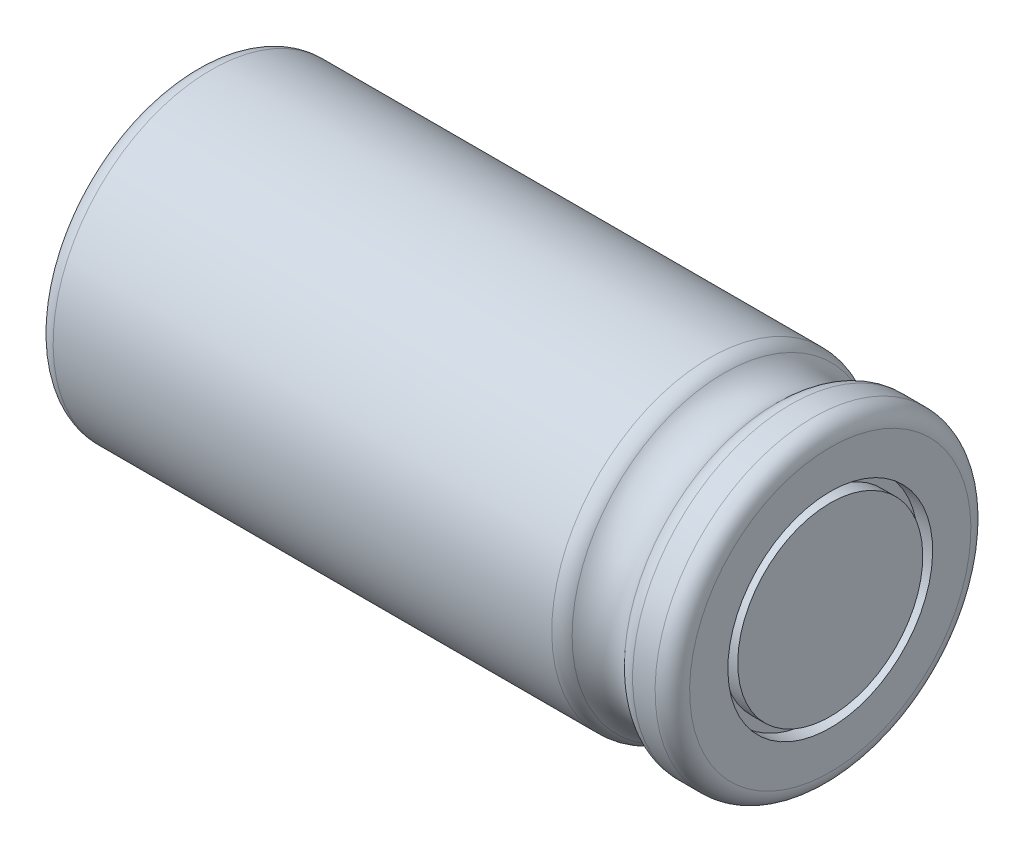
ISO-10303-21;
HEADER;
FILE_DESCRIPTION(('STEP AP214'),'2;1');
FILE_NAME('part.step','',(''),(''),'','','');
FILE_SCHEMA(('AUTOMOTIVE_DESIGN { 1 0 10303 214 1 1 1 1 }'));
ENDSEC;
DATA;
#1=APPLICATION_CONTEXT('core data for automotive mechanical design processes');
#2=APPLICATION_PROTOCOL_DEFINITION('international standard','automotive_design',2000,#1);
#3=PRODUCT_CONTEXT('',#1,'mechanical');
#4=PRODUCT('Part','Part','',(#3));
#5=PRODUCT_RELATED_PRODUCT_CATEGORY('part','',(#4));
#6=PRODUCT_DEFINITION_FORMATION('','',#4);
#7=PRODUCT_DEFINITION_CONTEXT('part definition',#1,'design');
#8=PRODUCT_DEFINITION('design','',#6,#7);
#9=PRODUCT_DEFINITION_SHAPE('','',#8);
#10=(LENGTH_UNIT() NAMED_UNIT(*) SI_UNIT(.MILLI.,.METRE.));
#11=(NAMED_UNIT(*) PLANE_ANGLE_UNIT() SI_UNIT($,.RADIAN.));
#12=(NAMED_UNIT(*) SI_UNIT($,.STERADIAN.) SOLID_ANGLE_UNIT());
#13=UNCERTAINTY_MEASURE_WITH_UNIT(LENGTH_MEASURE(1.E-05),#10,'distance_accuracy_value','');
#14=(GEOMETRIC_REPRESENTATION_CONTEXT(3) GLOBAL_UNCERTAINTY_ASSIGNED_CONTEXT((#13)) GLOBAL_UNIT_ASSIGNED_CONTEXT((#10,
#11,#12)) REPRESENTATION_CONTEXT('',''));
#15=CARTESIAN_POINT('',(0.,0.,0.));
#16=DIRECTION('',(0.,0.,1.));
#17=DIRECTION('',(1.,0.,0.));
#18=AXIS2_PLACEMENT_3D('',#15,#16,#17);
#19=CARTESIAN_POINT('',(0.,0.,0.));
#20=DIRECTION('',(-1.,0.,0.));
#21=DIRECTION('',(0.,-1.,0.));
#22=AXIS2_PLACEMENT_3D('',#19,#20,#21);
#23=PLANE('',#22);
#24=CARTESIAN_POINT('',(0.,0.,0.));
#25=DIRECTION('',(1.,0.,0.));
#26=DIRECTION('',(0.,1.,0.));
#27=AXIS2_PLACEMENT_3D('',#24,#25,#26);
#28=CIRCLE('',#27,4.85);
#29=CARTESIAN_POINT('',(0.,4.85,0.));
#30=VERTEX_POINT('',#29);
#31=EDGE_CURVE('E205',#30,#30,#28,.T.);
#32=ORIENTED_EDGE('',*,*,#31,.F.);
#33=EDGE_LOOP('',(#32));
#34=FACE_BOUND('',#33,.T.);
#35=DIRECTION('',(0.,-0.499999999999998,0.86602540378444));
#36=VECTOR('',#35,1.);
#37=CARTESIAN_POINT('',(0.,-0.043301270189222,-0.0249999999999999));
#38=LINE('',#37,#36);
#39=CARTESIAN_POINT('',(0.,-0.0577350269189625,0.));
#40=VERTEX_POINT('',#39);
#41=CARTESIAN_POINT('',(0.,-2.29330127018921,3.87211431702998));
#42=VERTEX_POINT('',#41);
#43=EDGE_CURVE('E176',#40,#42,#38,.T.);
#44=ORIENTED_EDGE('',*,*,#43,.F.);
#45=DIRECTION('',(0.,-0.499999999999998,-0.86602540378444));
#46=VECTOR('',#45,1.);
#47=CARTESIAN_POINT('',(0.,-0.043301270189222,0.0249999999999999));
#48=LINE('',#47,#46);
#49=CARTESIAN_POINT('',(0.,-2.29330127018921,-3.87211431702998));
#50=VERTEX_POINT('',#49);
#51=EDGE_CURVE('E122',#40,#50,#48,.T.);
#52=ORIENTED_EDGE('',*,*,#51,.T.);
#53=DIRECTION('',(0.,0.866025403784439,-0.5));
#54=VECTOR('',#53,1.);
#55=CARTESIAN_POINT('',(0.,-2.29330127018921,-3.87211431702998));
#56=LINE('',#55,#54);
#57=CARTESIAN_POINT('',(0.,-2.20669872981077,-3.92211431702998));
#58=VERTEX_POINT('',#57);
#59=EDGE_CURVE('E394',#50,#58,#56,.T.);
#60=ORIENTED_EDGE('',*,*,#59,.T.);
#61=DIRECTION('',(0.,-0.499999999999998,-0.86602540378444));
#62=VECTOR('',#61,1.);
#63=CARTESIAN_POINT('',(0.,0.043301270189222,-0.0249999999999999));
#64=LINE('',#63,#62);
#65=CARTESIAN_POINT('',(0.,0.0288675134594815,-0.0500000000000001));
#66=VERTEX_POINT('',#65);
#67=EDGE_CURVE('E191',#66,#58,#64,.T.);
#68=ORIENTED_EDGE('',*,*,#67,.F.);
#69=DIRECTION('',(0.,-1.,0.));
#70=VECTOR('',#69,1.);
#71=CARTESIAN_POINT('',(0.,4.5,-0.05));
#72=LINE('',#71,#70);
#73=CARTESIAN_POINT('',(0.,4.5,-0.05));
#74=VERTEX_POINT('',#73);
#75=EDGE_CURVE('E170',#74,#66,#72,.T.);
#76=ORIENTED_EDGE('',*,*,#75,.F.);
#77=DIRECTION('',(0.,0.,1.));
#78=VECTOR('',#77,1.);
#79=CARTESIAN_POINT('',(0.,4.5,-0.05));
#80=LINE('',#79,#78);
#81=CARTESIAN_POINT('',(0.,4.5,0.05));
#82=VERTEX_POINT('',#81);
#83=EDGE_CURVE('E180',#74,#82,#80,.T.);
#84=ORIENTED_EDGE('',*,*,#83,.T.);
#85=DIRECTION('',(0.,-1.,0.));
#86=VECTOR('',#85,1.);
#87=CARTESIAN_POINT('',(0.,4.5,0.05));
#88=LINE('',#87,#86);
#89=CARTESIAN_POINT('',(0.,0.0288675134594814,0.05));
#90=VERTEX_POINT('',#89);
#91=EDGE_CURVE('E186',#82,#90,#88,.T.);
#92=ORIENTED_EDGE('',*,*,#91,.T.);
#93=DIRECTION('',(0.,-0.499999999999998,0.86602540378444));
#94=VECTOR('',#93,1.);
#95=CARTESIAN_POINT('',(0.,0.043301270189222,0.0249999999999999));
#96=LINE('',#95,#94);
#97=CARTESIAN_POINT('',(0.,-2.20669872981077,3.92211431702998));
#98=VERTEX_POINT('',#97);
#99=EDGE_CURVE('E374',#90,#98,#96,.T.);
#100=ORIENTED_EDGE('',*,*,#99,.T.);
#101=DIRECTION('',(0.,-0.866025403784441,-0.499999999999997));
#102=VECTOR('',#101,1.);
#103=CARTESIAN_POINT('',(0.,-2.20669872981077,3.92211431702998));
#104=LINE('',#103,#102);
#105=EDGE_CURVE('E378',#98,#42,#104,.T.);
#106=ORIENTED_EDGE('',*,*,#105,.T.);
#107=EDGE_LOOP('',(#44,#52,#60,#68,#76,#84,#92,#100,#106));
#108=FACE_BOUND('',#107,.T.);
#109=ADVANCED_FACE('F107',(#34,#108),#23,.T.);
#110=CARTESIAN_POINT('',(25.7,3.75,0.));
#111=DIRECTION('',(1.,0.,0.));
#112=DIRECTION('',(0.,1.,0.));
#113=AXIS2_PLACEMENT_3D('',#110,#111,#112);
#114=PLANE('',#113);
#115=CARTESIAN_POINT('',(25.7,0.,0.));
#116=DIRECTION('',(1.,0.,0.));
#117=DIRECTION('',(0.,1.,0.));
#118=AXIS2_PLACEMENT_3D('',#115,#116,#117);
#119=CIRCLE('',#118,3.75);
#120=CARTESIAN_POINT('',(25.7,3.75,0.));
#121=VERTEX_POINT('',#120);
#122=EDGE_CURVE('E222',#121,#121,#119,.T.);
#123=ORIENTED_EDGE('',*,*,#122,.T.);
#124=EDGE_LOOP('',(#123));
#125=FACE_BOUND('',#124,.T.);
#126=ADVANCED_FACE('F288',(#125),#114,.T.);
#127=CARTESIAN_POINT('',(25.7,0.,0.));
#128=DIRECTION('',(1.,0.,0.));
#129=DIRECTION('',(0.,1.,0.));
#130=AXIS2_PLACEMENT_3D('',#127,#128,#129);
#131=CYLINDRICAL_SURFACE('',#130,3.75);
#132=CARTESIAN_POINT('',(25.1,0.,0.));
#133=DIRECTION('',(1.,0.,0.));
#134=DIRECTION('',(0.,1.,0.));
#135=AXIS2_PLACEMENT_3D('',#132,#133,#134);
#136=CIRCLE('',#135,3.75);
#137=CARTESIAN_POINT('',(25.1,3.75,0.));
#138=VERTEX_POINT('',#137);
#139=EDGE_CURVE('E219',#138,#138,#136,.T.);
#140=ORIENTED_EDGE('',*,*,#139,.T.);
#141=EDGE_LOOP('',(#140));
#142=FACE_BOUND('',#141,.T.);
#143=ORIENTED_EDGE('',*,*,#122,.F.);
#144=EDGE_LOOP('',(#143));
#145=FACE_BOUND('',#144,.T.);
#146=ADVANCED_FACE('F282',(#142,#145),#131,.T.);
#147=CARTESIAN_POINT('',(25.1,4.15,0.));
#148=DIRECTION('',(1.,0.,0.));
#149=DIRECTION('',(0.,1.,0.));
#150=AXIS2_PLACEMENT_3D('',#147,#148,#149);
#151=PLANE('',#150);
#152=CARTESIAN_POINT('',(25.1,0.,0.));
#153=DIRECTION('',(1.,0.,0.));
#154=DIRECTION('',(0.,1.,0.));
#155=AXIS2_PLACEMENT_3D('',#152,#153,#154);
#156=CIRCLE('',#155,4.15);
#157=CARTESIAN_POINT('',(25.1,4.15,0.));
#158=VERTEX_POINT('',#157);
#159=EDGE_CURVE('E216',#158,#158,#156,.T.);
#160=ORIENTED_EDGE('',*,*,#159,.T.);
#161=EDGE_LOOP('',(#160));
#162=FACE_BOUND('',#161,.T.);
#163=ORIENTED_EDGE('',*,*,#139,.F.);
#164=EDGE_LOOP('',(#163));
#165=FACE_BOUND('',#164,.T.);
#166=ADVANCED_FACE('F276',(#162,#165),#151,.T.);
#167=CARTESIAN_POINT('',(25.7,0.,0.));
#168=DIRECTION('',(1.,0.,0.));
#169=DIRECTION('',(0.,1.,0.));
#170=AXIS2_PLACEMENT_3D('',#167,#168,#169);
#171=CYLINDRICAL_SURFACE('',#170,4.15);
#172=CARTESIAN_POINT('',(25.7,0.,0.));
#173=DIRECTION('',(1.,0.,0.));
#174=DIRECTION('',(0.,1.,0.));
#175=AXIS2_PLACEMENT_3D('',#172,#173,#174);
#176=CIRCLE('',#175,4.15);
#177=CARTESIAN_POINT('',(25.7,4.15,0.));
#178=VERTEX_POINT('',#177);
#179=EDGE_CURVE('E213',#178,#178,#176,.T.);
#180=ORIENTED_EDGE('',*,*,#179,.T.);
#181=EDGE_LOOP('',(#180));
#182=FACE_BOUND('',#181,.T.);
#183=ORIENTED_EDGE('',*,*,#159,.F.);
#184=EDGE_LOOP('',(#183));
#185=FACE_BOUND('',#184,.T.);
#186=ADVANCED_FACE('F270',(#182,#185),#171,.F.);
#187=CARTESIAN_POINT('',(25.7,6.4,0.));
#188=DIRECTION('',(1.,0.,0.));
#189=DIRECTION('',(0.,1.,0.));
#190=AXIS2_PLACEMENT_3D('',#187,#188,#189);
#191=PLANE('',#190);
#192=CARTESIAN_POINT('',(25.7,0.,0.));
#193=DIRECTION('',(1.,0.,0.));
#194=DIRECTION('',(0.,1.,0.));
#195=AXIS2_PLACEMENT_3D('',#192,#193,#194);
#196=CIRCLE('',#195,5.7);
#197=CARTESIAN_POINT('',(25.7,5.7,0.));
#198=VERTEX_POINT('',#197);
#199=EDGE_CURVE('E225',#198,#198,#196,.T.);
#200=ORIENTED_EDGE('',*,*,#199,.T.);
#201=EDGE_LOOP('',(#200));
#202=FACE_BOUND('',#201,.T.);
#203=ORIENTED_EDGE('',*,*,#179,.F.);
#204=EDGE_LOOP('',(#203));
#205=FACE_BOUND('',#204,.T.);
#206=ADVANCED_FACE('F257',(#202,#205),#191,.T.);
#207=CARTESIAN_POINT('',(25.7,0.,0.));
#208=DIRECTION('',(1.,0.,0.));
#209=DIRECTION('',(0.,1.,0.));
#210=AXIS2_PLACEMENT_3D('',#207,#208,#209);
#211=CYLINDRICAL_SURFACE('',#210,6.4);
#212=CARTESIAN_POINT('',(24.0878339354163,0.,0.));
#213=DIRECTION('',(-1.,0.,0.));
#214=DIRECTION('',(0.,-1.,0.));
#215=AXIS2_PLACEMENT_3D('',#212,#213,#214);
#216=CIRCLE('',#215,6.4);
#217=CARTESIAN_POINT('',(24.0878339354163,-6.4,0.));
#218=VERTEX_POINT('',#217);
#219=EDGE_CURVE('E237',#218,#218,#216,.F.);
#220=ORIENTED_EDGE('',*,*,#219,.T.);
#221=EDGE_LOOP('',(#220));
#222=FACE_BOUND('',#221,.T.);
#223=CARTESIAN_POINT('',(25.,0.,0.));
#224=DIRECTION('',(1.,0.,0.));
#225=DIRECTION('',(0.,1.,0.));
#226=AXIS2_PLACEMENT_3D('',#223,#224,#225);
#227=CIRCLE('',#226,6.4);
#228=CARTESIAN_POINT('',(25.,6.4,0.));
#229=VERTEX_POINT('',#228);
#230=EDGE_CURVE('E228',#229,#229,#227,.F.);
#231=ORIENTED_EDGE('',*,*,#230,.T.);
#232=EDGE_LOOP('',(#231));
#233=FACE_BOUND('',#232,.T.);
#234=ADVANCED_FACE('F254',(#222,#233),#211,.T.);
#235=CARTESIAN_POINT('',(22.45,0.,0.));
#236=DIRECTION('',(1.,0.,0.));
#237=DIRECTION('',(0.,1.,0.));
#238=AXIS2_PLACEMENT_3D('',#235,#236,#237);
#239=TOROIDAL_SURFACE('',#238,7.16607142857143,1.46607142857143);
#240=CARTESIAN_POINT('',(23.5096230582952,0.,0.));
#241=DIRECTION('',(-1.,0.,0.));
#242=DIRECTION('',(0.,-1.,0.));
#243=AXIS2_PLACEMENT_3D('',#240,#241,#242);
#244=CIRCLE('',#243,6.15287628053601);
#245=CARTESIAN_POINT('',(23.5096230582952,-6.15287628053601,0.));
#246=VERTEX_POINT('',#245);
#247=EDGE_CURVE('E115',#246,#246,#244,.T.);
#248=ORIENTED_EDGE('',*,*,#247,.T.);
#249=EDGE_LOOP('',(#248));
#250=FACE_BOUND('',#249,.T.);
#251=CARTESIAN_POINT('',(21.3903769417048,0.,0.));
#252=DIRECTION('',(1.,0.,0.));
#253=DIRECTION('',(0.,1.,0.));
#254=AXIS2_PLACEMENT_3D('',#251,#252,#253);
#255=CIRCLE('',#254,6.15287628053601);
#256=CARTESIAN_POINT('',(21.3903769417048,6.15287628053601,0.));
#257=VERTEX_POINT('',#256);
#258=EDGE_CURVE('E240',#257,#257,#255,.T.);
#259=ORIENTED_EDGE('',*,*,#258,.T.);
#260=EDGE_LOOP('',(#259));
#261=FACE_BOUND('',#260,.T.);
#262=ADVANCED_FACE('F245',(#250,#261),#239,.F.);
#263=CARTESIAN_POINT('',(25.7,0.,0.));
#264=DIRECTION('',(1.,0.,0.));
#265=DIRECTION('',(0.,1.,0.));
#266=AXIS2_PLACEMENT_3D('',#263,#264,#265);
#267=CYLINDRICAL_SURFACE('',#266,6.4);
#268=CARTESIAN_POINT('',(20.8121660645837,0.,0.));
#269=DIRECTION('',(-1.,0.,0.));
#270=DIRECTION('',(0.,-1.,0.));
#271=AXIS2_PLACEMENT_3D('',#268,#269,#270);
#272=CIRCLE('',#271,6.4);
#273=CARTESIAN_POINT('',(20.8121660645837,-6.4,0.));
#274=VERTEX_POINT('',#273);
#275=EDGE_CURVE('E12',#274,#274,#272,.T.);
#276=ORIENTED_EDGE('',*,*,#275,.T.);
#277=EDGE_LOOP('',(#276));
#278=FACE_BOUND('',#277,.T.);
#279=CARTESIAN_POINT('',(0.6,0.,0.));
#280=DIRECTION('',(-1.,0.,0.));
#281=DIRECTION('',(0.,-1.,0.));
#282=AXIS2_PLACEMENT_3D('',#279,#280,#281);
#283=CIRCLE('',#282,6.4);
#284=CARTESIAN_POINT('',(0.6,-6.4,0.));
#285=VERTEX_POINT('',#284);
#286=EDGE_CURVE('E231',#285,#285,#283,.F.);
#287=ORIENTED_EDGE('',*,*,#286,.T.);
#288=EDGE_LOOP('',(#287));
#289=FACE_BOUND('',#288,.T.);
#290=ADVANCED_FACE('F308',(#278,#289),#267,.T.);
#291=CARTESIAN_POINT('',(-0.1,4.85,0.));
#292=DIRECTION('',(-1.,0.,0.));
#293=DIRECTION('',(0.,-1.,0.));
#294=AXIS2_PLACEMENT_3D('',#291,#292,#293);
#295=PLANE('',#294);
#296=CARTESIAN_POINT('',(-0.1,0.,0.));
#297=DIRECTION('',(-1.,0.,0.));
#298=DIRECTION('',(0.,-1.,0.));
#299=AXIS2_PLACEMENT_3D('',#296,#297,#298);
#300=CIRCLE('',#299,5.7);
#301=CARTESIAN_POINT('',(-0.1,-5.7,0.));
#302=VERTEX_POINT('',#301);
#303=EDGE_CURVE('E234',#302,#302,#300,.T.);
#304=ORIENTED_EDGE('',*,*,#303,.T.);
#305=EDGE_LOOP('',(#304));
#306=FACE_BOUND('',#305,.T.);
#307=CARTESIAN_POINT('',(-0.0999999999999994,0.,0.));
#308=DIRECTION('',(1.,0.,0.));
#309=DIRECTION('',(0.,1.,0.));
#310=AXIS2_PLACEMENT_3D('',#307,#308,#309);
#311=CIRCLE('',#310,4.85);
#312=CARTESIAN_POINT('',(-0.0999999999999994,4.85,0.));
#313=VERTEX_POINT('',#312);
#314=EDGE_CURVE('E210',#313,#313,#311,.T.);
#315=ORIENTED_EDGE('',*,*,#314,.T.);
#316=EDGE_LOOP('',(#315));
#317=FACE_BOUND('',#316,.T.);
#318=ADVANCED_FACE('F310',(#306,#317),#295,.T.);
#319=CARTESIAN_POINT('',(25.7,0.,0.));
#320=DIRECTION('',(1.,0.,0.));
#321=DIRECTION('',(0.,1.,0.));
#322=AXIS2_PLACEMENT_3D('',#319,#320,#321);
#323=CYLINDRICAL_SURFACE('',#322,4.85);
#324=ORIENTED_EDGE('',*,*,#31,.T.);
#325=EDGE_LOOP('',(#324));
#326=FACE_BOUND('',#325,.T.);
#327=ORIENTED_EDGE('',*,*,#314,.F.);
#328=EDGE_LOOP('',(#327));
#329=FACE_BOUND('',#328,.T.);
#330=ADVANCED_FACE('F264',(#326,#329),#323,.F.);
#331=CARTESIAN_POINT('',(25.,0.,0.));
#332=DIRECTION('',(1.,0.,0.));
#333=DIRECTION('',(0.,1.,0.));
#334=AXIS2_PLACEMENT_3D('',#331,#332,#333);
#335=TOROIDAL_SURFACE('',#334,5.7,0.7);
#336=ORIENTED_EDGE('',*,*,#230,.F.);
#337=EDGE_LOOP('',(#336));
#338=FACE_BOUND('',#337,.T.);
#339=ORIENTED_EDGE('',*,*,#199,.F.);
#340=EDGE_LOOP('',(#339));
#341=FACE_BOUND('',#340,.T.);
#342=ADVANCED_FACE('F261',(#338,#341),#335,.T.);
#343=CARTESIAN_POINT('',(0.6,0.,0.));
#344=DIRECTION('',(-1.,0.,0.));
#345=DIRECTION('',(0.,-1.,0.));
#346=AXIS2_PLACEMENT_3D('',#343,#344,#345);
#347=TOROIDAL_SURFACE('',#346,5.7,0.7);
#348=ORIENTED_EDGE('',*,*,#303,.F.);
#349=EDGE_LOOP('',(#348));
#350=FACE_BOUND('',#349,.T.);
#351=ORIENTED_EDGE('',*,*,#286,.F.);
#352=EDGE_LOOP('',(#351));
#353=FACE_BOUND('',#352,.T.);
#354=ADVANCED_FACE('F251',(#350,#353),#347,.T.);
#355=CARTESIAN_POINT('',(24.0878339354163,0.,0.));
#356=DIRECTION('',(-1.,0.,0.));
#357=DIRECTION('',(0.,-1.,0.));
#358=AXIS2_PLACEMENT_3D('',#355,#356,#357);
#359=TOROIDAL_SURFACE('',#358,5.60000000000012,0.8);
#360=ORIENTED_EDGE('',*,*,#247,.F.);
#361=EDGE_LOOP('',(#360));
#362=FACE_BOUND('',#361,.T.);
#363=ORIENTED_EDGE('',*,*,#219,.F.);
#364=EDGE_LOOP('',(#363));
#365=FACE_BOUND('',#364,.T.);
#366=ADVANCED_FACE('F248',(#362,#365),#359,.T.);
#367=CARTESIAN_POINT('',(20.8121660645837,0.,0.));
#368=DIRECTION('',(-1.,0.,0.));
#369=DIRECTION('',(0.,-1.,0.));
#370=AXIS2_PLACEMENT_3D('',#367,#368,#369);
#371=TOROIDAL_SURFACE('',#370,5.60000000000012,0.8);
#372=ORIENTED_EDGE('',*,*,#275,.F.);
#373=EDGE_LOOP('',(#372));
#374=FACE_BOUND('',#373,.T.);
#375=ORIENTED_EDGE('',*,*,#258,.F.);
#376=EDGE_LOOP('',(#375));
#377=FACE_BOUND('',#376,.T.);
#378=ADVANCED_FACE('F109',(#374,#377),#371,.T.);
#379=CARTESIAN_POINT('',(0.1,0.,0.));
#380=DIRECTION('',(1.,0.,0.));
#381=DIRECTION('',(0.,0.,-1.));
#382=AXIS2_PLACEMENT_3D('',#379,#380,#381);
#383=PLANE('',#382);
#384=DIRECTION('',(0.,-1.,0.));
#385=VECTOR('',#384,1.);
#386=CARTESIAN_POINT('',(0.1,4.5,0.05));
#387=LINE('',#386,#385);
#388=CARTESIAN_POINT('',(0.1,4.5,0.05));
#389=VERTEX_POINT('',#388);
#390=CARTESIAN_POINT('',(0.1,0.0288675134594814,0.05));
#391=VERTEX_POINT('',#390);
#392=EDGE_CURVE('E365',#389,#391,#387,.T.);
#393=ORIENTED_EDGE('',*,*,#392,.F.);
#394=DIRECTION('',(0.,0.,1.));
#395=VECTOR('',#394,1.);
#396=CARTESIAN_POINT('',(0.1,4.5,-0.05));
#397=LINE('',#396,#395);
#398=CARTESIAN_POINT('',(0.1,4.5,-0.05));
#399=VERTEX_POINT('',#398);
#400=EDGE_CURVE('E195',#399,#389,#397,.T.);
#401=ORIENTED_EDGE('',*,*,#400,.F.);
#402=DIRECTION('',(0.,-1.,0.));
#403=VECTOR('',#402,1.);
#404=CARTESIAN_POINT('',(0.1,4.5,-0.05));
#405=LINE('',#404,#403);
#406=CARTESIAN_POINT('',(0.1,0.0288675134594815,-0.0500000000000001));
#407=VERTEX_POINT('',#406);
#408=EDGE_CURVE('E173',#399,#407,#405,.T.);
#409=ORIENTED_EDGE('',*,*,#408,.T.);
#410=DIRECTION('',(0.,-0.499999999999998,-0.86602540378444));
#411=VECTOR('',#410,1.);
#412=CARTESIAN_POINT('',(0.1,0.043301270189222,-0.0249999999999999));
#413=LINE('',#412,#411);
#414=CARTESIAN_POINT('',(0.1,-2.20669872981077,-3.92211431702998));
#415=VERTEX_POINT('',#414);
#416=EDGE_CURVE('E393',#407,#415,#413,.T.);
#417=ORIENTED_EDGE('',*,*,#416,.T.);
#418=DIRECTION('',(0.,0.866025403784439,-0.5));
#419=VECTOR('',#418,1.);
#420=CARTESIAN_POINT('',(0.1,-2.29330127018921,-3.87211431702998));
#421=LINE('',#420,#419);
#422=CARTESIAN_POINT('',(0.1,-2.29330127018921,-3.87211431702998));
#423=VERTEX_POINT('',#422);
#424=EDGE_CURVE('E398',#423,#415,#421,.T.);
#425=ORIENTED_EDGE('',*,*,#424,.F.);
#426=DIRECTION('',(0.,-0.499999999999998,-0.86602540378444));
#427=VECTOR('',#426,1.);
#428=CARTESIAN_POINT('',(0.1,-0.043301270189222,0.0249999999999999));
#429=LINE('',#428,#427);
#430=CARTESIAN_POINT('',(0.1,-0.0577350269189625,0.));
#431=VERTEX_POINT('',#430);
#432=EDGE_CURVE('E390',#431,#423,#429,.T.);
#433=ORIENTED_EDGE('',*,*,#432,.F.);
#434=DIRECTION('',(0.,-0.499999999999998,0.86602540378444));
#435=VECTOR('',#434,1.);
#436=CARTESIAN_POINT('',(0.1,-0.043301270189222,-0.0249999999999999));
#437=LINE('',#436,#435);
#438=CARTESIAN_POINT('',(0.1,-2.29330127018921,3.87211431702998));
#439=VERTEX_POINT('',#438);
#440=EDGE_CURVE('E377',#431,#439,#437,.T.);
#441=ORIENTED_EDGE('',*,*,#440,.T.);
#442=DIRECTION('',(0.,-0.866025403784441,-0.499999999999997));
#443=VECTOR('',#442,1.);
#444=CARTESIAN_POINT('',(0.1,-2.20669872981077,3.92211431702998));
#445=LINE('',#444,#443);
#446=CARTESIAN_POINT('',(0.1,-2.20669872981077,3.92211431702998));
#447=VERTEX_POINT('',#446);
#448=EDGE_CURVE('E383',#447,#439,#445,.T.);
#449=ORIENTED_EDGE('',*,*,#448,.F.);
#450=DIRECTION('',(0.,-0.499999999999998,0.86602540378444));
#451=VECTOR('',#450,1.);
#452=CARTESIAN_POINT('',(0.1,0.043301270189222,0.0249999999999999));
#453=LINE('',#452,#451);
#454=EDGE_CURVE('E367',#391,#447,#453,.T.);
#455=ORIENTED_EDGE('',*,*,#454,.F.);
#456=EDGE_LOOP('',(#393,#401,#409,#417,#425,#433,#441,#449,#455));
#457=FACE_BOUND('',#456,.T.);
#458=ADVANCED_FACE('F339',(#457),#383,.F.);
#459=CARTESIAN_POINT('',(0.1,-0.043301270189222,0.0249999999999999));
#460=DIRECTION('',(0.,0.86602540378444,-0.499999999999998));
#461=DIRECTION('',(0.,0.499999999999998,0.86602540378444));
#462=AXIS2_PLACEMENT_3D('',#459,#460,#461);
#463=PLANE('',#462);
#464=ORIENTED_EDGE('',*,*,#432,.T.);
#465=DIRECTION('',(-1.,0.,0.));
#466=VECTOR('',#465,1.);
#467=CARTESIAN_POINT('',(0.1,-2.29330127018921,-3.87211431702998));
#468=LINE('',#467,#466);
#469=EDGE_CURVE('E207',#423,#50,#468,.T.);
#470=ORIENTED_EDGE('',*,*,#469,.T.);
#471=ORIENTED_EDGE('',*,*,#51,.F.);
#472=DIRECTION('',(-1.,0.,0.));
#473=VECTOR('',#472,1.);
#474=CARTESIAN_POINT('',(0.1,-0.0577350269189625,0.));
#475=LINE('',#474,#473);
#476=EDGE_CURVE('E127',#431,#40,#475,.T.);
#477=ORIENTED_EDGE('',*,*,#476,.F.);
#478=EDGE_LOOP('',(#464,#470,#471,#477));
#479=FACE_BOUND('',#478,.T.);
#480=ADVANCED_FACE('F352',(#479),#463,.T.);
#481=CARTESIAN_POINT('',(0.1,-2.29330127018921,-3.87211431702998));
#482=DIRECTION('',(0.,0.5,0.866025403784439));
#483=DIRECTION('',(0.,-0.866025403784439,0.5));
#484=AXIS2_PLACEMENT_3D('',#481,#482,#483);
#485=PLANE('',#484);
#486=ORIENTED_EDGE('',*,*,#59,.F.);
#487=ORIENTED_EDGE('',*,*,#469,.F.);
#488=ORIENTED_EDGE('',*,*,#424,.T.);
#489=DIRECTION('',(-1.,0.,0.));
#490=VECTOR('',#489,1.);
#491=CARTESIAN_POINT('',(0.1,-2.20669872981077,-3.92211431702998));
#492=LINE('',#491,#490);
#493=EDGE_CURVE('E387',#415,#58,#492,.T.);
#494=ORIENTED_EDGE('',*,*,#493,.T.);
#495=EDGE_LOOP('',(#486,#487,#488,#494));
#496=FACE_BOUND('',#495,.T.);
#497=ADVANCED_FACE('F348',(#496),#485,.T.);
#498=CARTESIAN_POINT('',(0.1,0.043301270189222,-0.0249999999999999));
#499=DIRECTION('',(0.,0.86602540378444,-0.499999999999998));
#500=DIRECTION('',(0.,0.499999999999998,0.86602540378444));
#501=AXIS2_PLACEMENT_3D('',#498,#499,#500);
#502=PLANE('',#501);
#503=DIRECTION('',(-1.,0.,0.));
#504=VECTOR('',#503,1.);
#505=CARTESIAN_POINT('',(0.1,0.0288675134594814,-0.05));
#506=LINE('',#505,#504);
#507=EDGE_CURVE('E202',#407,#66,#506,.T.);
#508=ORIENTED_EDGE('',*,*,#507,.T.);
#509=ORIENTED_EDGE('',*,*,#67,.T.);
#510=ORIENTED_EDGE('',*,*,#493,.F.);
#511=ORIENTED_EDGE('',*,*,#416,.F.);
#512=EDGE_LOOP('',(#508,#509,#510,#511));
#513=FACE_BOUND('',#512,.T.);
#514=ADVANCED_FACE('F326',(#513),#502,.F.);
#515=CARTESIAN_POINT('',(0.1,4.5,-0.05));
#516=DIRECTION('',(0.,0.,-1.));
#517=DIRECTION('',(0.,1.,0.));
#518=AXIS2_PLACEMENT_3D('',#515,#516,#517);
#519=PLANE('',#518);
#520=ORIENTED_EDGE('',*,*,#408,.F.);
#521=DIRECTION('',(-1.,0.,0.));
#522=VECTOR('',#521,1.);
#523=CARTESIAN_POINT('',(0.1,4.5,-0.05));
#524=LINE('',#523,#522);
#525=EDGE_CURVE('E166',#399,#74,#524,.T.);
#526=ORIENTED_EDGE('',*,*,#525,.T.);
#527=ORIENTED_EDGE('',*,*,#75,.T.);
#528=ORIENTED_EDGE('',*,*,#507,.F.);
#529=EDGE_LOOP('',(#520,#526,#527,#528));
#530=FACE_BOUND('',#529,.T.);
#531=ADVANCED_FACE('F168',(#530),#519,.F.);
#532=CARTESIAN_POINT('',(0.1,4.5,-0.05));
#533=DIRECTION('',(0.,-1.,0.));
#534=DIRECTION('',(1.,0.,0.));
#535=AXIS2_PLACEMENT_3D('',#532,#533,#534);
#536=PLANE('',#535);
#537=ORIENTED_EDGE('',*,*,#83,.F.);
#538=ORIENTED_EDGE('',*,*,#525,.F.);
#539=ORIENTED_EDGE('',*,*,#400,.T.);
#540=DIRECTION('',(-1.,0.,0.));
#541=VECTOR('',#540,1.);
#542=CARTESIAN_POINT('',(0.1,4.5,0.05));
#543=LINE('',#542,#541);
#544=EDGE_CURVE('E177',#389,#82,#543,.T.);
#545=ORIENTED_EDGE('',*,*,#544,.T.);
#546=EDGE_LOOP('',(#537,#538,#539,#545));
#547=FACE_BOUND('',#546,.T.);
#548=ADVANCED_FACE('F181',(#547),#536,.T.);
#549=CARTESIAN_POINT('',(0.1,4.5,0.05));
#550=DIRECTION('',(0.,0.,-1.));
#551=DIRECTION('',(0.,1.,0.));
#552=AXIS2_PLACEMENT_3D('',#549,#550,#551);
#553=PLANE('',#552);
#554=ORIENTED_EDGE('',*,*,#91,.F.);
#555=ORIENTED_EDGE('',*,*,#544,.F.);
#556=ORIENTED_EDGE('',*,*,#392,.T.);
#557=DIRECTION('',(1.,0.,0.));
#558=VECTOR('',#557,1.);
#559=CARTESIAN_POINT('',(0.1,0.0288675134594814,0.05));
#560=LINE('',#559,#558);
#561=EDGE_CURVE('E199',#90,#391,#560,.T.);
#562=ORIENTED_EDGE('',*,*,#561,.F.);
#563=EDGE_LOOP('',(#554,#555,#556,#562));
#564=FACE_BOUND('',#563,.T.);
#565=ADVANCED_FACE('F327',(#564),#553,.T.);
#566=CARTESIAN_POINT('',(0.1,0.043301270189222,0.0249999999999999));
#567=DIRECTION('',(0.,-0.86602540378444,-0.499999999999998));
#568=DIRECTION('',(0.,0.499999999999998,-0.86602540378444));
#569=AXIS2_PLACEMENT_3D('',#566,#567,#568);
#570=PLANE('',#569);
#571=ORIENTED_EDGE('',*,*,#561,.T.);
#572=ORIENTED_EDGE('',*,*,#454,.T.);
#573=DIRECTION('',(-1.,0.,0.));
#574=VECTOR('',#573,1.);
#575=CARTESIAN_POINT('',(0.1,-2.20669872981077,3.92211431702998));
#576=LINE('',#575,#574);
#577=EDGE_CURVE('E201',#447,#98,#576,.T.);
#578=ORIENTED_EDGE('',*,*,#577,.T.);
#579=ORIENTED_EDGE('',*,*,#99,.F.);
#580=EDGE_LOOP('',(#571,#572,#578,#579));
#581=FACE_BOUND('',#580,.T.);
#582=ADVANCED_FACE('F330',(#581),#570,.T.);
#583=CARTESIAN_POINT('',(0.1,-2.20669872981077,3.92211431702998));
#584=DIRECTION('',(0.,0.499999999999997,-0.86602540378444));
#585=DIRECTION('',(0.,0.866025403784441,0.499999999999997));
#586=AXIS2_PLACEMENT_3D('',#583,#584,#585);
#587=PLANE('',#586);
#588=ORIENTED_EDGE('',*,*,#105,.F.);
#589=ORIENTED_EDGE('',*,*,#577,.F.);
#590=ORIENTED_EDGE('',*,*,#448,.T.);
#591=DIRECTION('',(-1.,0.,0.));
#592=VECTOR('',#591,1.);
#593=CARTESIAN_POINT('',(0.1,-2.29330127018921,3.87211431702998));
#594=LINE('',#593,#592);
#595=EDGE_CURVE('E370',#439,#42,#594,.T.);
#596=ORIENTED_EDGE('',*,*,#595,.T.);
#597=EDGE_LOOP('',(#588,#589,#590,#596));
#598=FACE_BOUND('',#597,.T.);
#599=ADVANCED_FACE('F337',(#598),#587,.T.);
#600=CARTESIAN_POINT('',(0.1,-0.043301270189222,-0.0249999999999999));
#601=DIRECTION('',(0.,-0.86602540378444,-0.499999999999998));
#602=DIRECTION('',(0.,0.499999999999998,-0.86602540378444));
#603=AXIS2_PLACEMENT_3D('',#600,#601,#602);
#604=PLANE('',#603);
#605=ORIENTED_EDGE('',*,*,#476,.T.);
#606=ORIENTED_EDGE('',*,*,#43,.T.);
#607=ORIENTED_EDGE('',*,*,#595,.F.);
#608=ORIENTED_EDGE('',*,*,#440,.F.);
#609=EDGE_LOOP('',(#605,#606,#607,#608));
#610=FACE_BOUND('',#609,.T.);
#611=ADVANCED_FACE('F334',(#610),#604,.F.);
#612=CLOSED_SHELL('',(#109,#126,#146,#166,#186,#206,#234,#262,#290,#318,#330,#342,#354,#366,
#378,#458,#480,#497,#514,#531,#548,#565,#582,#599,#611));
#613=MANIFOLD_SOLID_BREP('B2',#612);
#614=ADVANCED_BREP_SHAPE_REPRESENTATION('',(#18,#613),#14);
#615=SHAPE_DEFINITION_REPRESENTATION(#9,#614);
ENDSEC;
END-ISO-10303-21;
